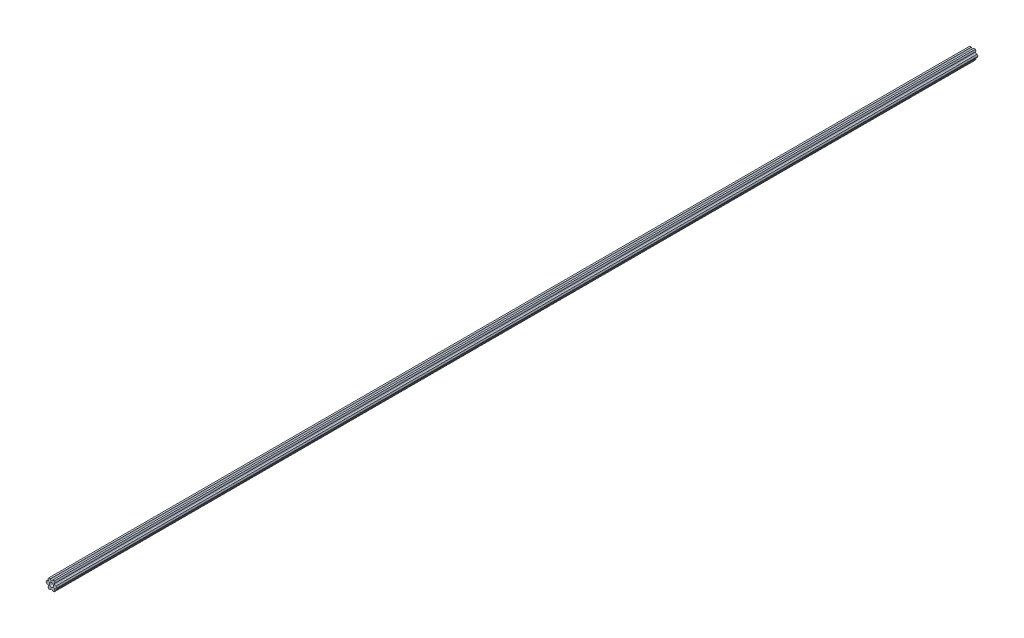
ISO-10303-21;
HEADER;
FILE_DESCRIPTION(('STEP AP214'),'2;1');
FILE_NAME('part.step','',(''),(''),'','','');
FILE_SCHEMA(('AUTOMOTIVE_DESIGN { 1 0 10303 214 1 1 1 1 }'));
ENDSEC;
DATA;
#1=APPLICATION_CONTEXT('core data for automotive mechanical design processes');
#2=APPLICATION_PROTOCOL_DEFINITION('international standard','automotive_design',2000,#1);
#3=PRODUCT_CONTEXT('',#1,'mechanical');
#4=PRODUCT('Part','Part','',(#3));
#5=PRODUCT_RELATED_PRODUCT_CATEGORY('part','',(#4));
#6=PRODUCT_DEFINITION_FORMATION('','',#4);
#7=PRODUCT_DEFINITION_CONTEXT('part definition',#1,'design');
#8=PRODUCT_DEFINITION('design','',#6,#7);
#9=PRODUCT_DEFINITION_SHAPE('','',#8);
#10=(LENGTH_UNIT() NAMED_UNIT(*) SI_UNIT(.MILLI.,.METRE.));
#11=(NAMED_UNIT(*) PLANE_ANGLE_UNIT() SI_UNIT($,.RADIAN.));
#12=(NAMED_UNIT(*) SI_UNIT($,.STERADIAN.) SOLID_ANGLE_UNIT());
#13=UNCERTAINTY_MEASURE_WITH_UNIT(LENGTH_MEASURE(1.E-05),#10,'distance_accuracy_value','');
#14=(GEOMETRIC_REPRESENTATION_CONTEXT(3) GLOBAL_UNCERTAINTY_ASSIGNED_CONTEXT((#13)) GLOBAL_UNIT_ASSIGNED_CONTEXT((#10,
#11,#12)) REPRESENTATION_CONTEXT('',''));
#15=CARTESIAN_POINT('',(0.,0.,0.));
#16=DIRECTION('',(0.,0.,1.));
#17=DIRECTION('',(1.,0.,0.));
#18=AXIS2_PLACEMENT_3D('',#15,#16,#17);
#19=CARTESIAN_POINT('',(4.06945337238307,2.3495,914.4));
#20=DIRECTION('',(0.,0.,-1.));
#21=DIRECTION('',(-1.,0.,0.));
#22=AXIS2_PLACEMENT_3D('',#19,#20,#21);
#23=PLANE('',#22);
#24=CARTESIAN_POINT('',(4.06945337238307,2.3495,914.4));
#25=DIRECTION('',(0.,0.,-1.));
#26=DIRECTION('',(-1.,0.,0.));
#27=AXIS2_PLACEMENT_3D('',#24,#25,#26);
#28=CIRCLE('',#27,1.0668);
#29=CARTESIAN_POINT('',(4.60285337238307,1.42562409924276,914.4));
#30=VERTEX_POINT('',#29);
#31=CARTESIAN_POINT('',(3.53605337238308,3.27337590075724,914.4));
#32=VERTEX_POINT('',#31);
#33=EDGE_CURVE('E235',#30,#32,#28,.T.);
#34=ORIENTED_EDGE('',*,*,#33,.T.);
#35=DIRECTION('',(-0.5,0.866025403784439,0.));
#36=VECTOR('',#35,1.);
#37=CARTESIAN_POINT('',(3.53605337238308,3.27337590075724,914.4));
#38=LINE('',#37,#36);
#39=CARTESIAN_POINT('',(2.71296891492205,4.699,914.4));
#40=VERTEX_POINT('',#39);
#41=EDGE_CURVE('E132',#32,#40,#38,.T.);
#42=ORIENTED_EDGE('',*,*,#41,.T.);
#43=DIRECTION('',(-1.,0.,0.));
#44=VECTOR('',#43,1.);
#45=CARTESIAN_POINT('',(2.71296891492205,4.699,914.4));
#46=LINE('',#45,#44);
#47=CARTESIAN_POINT('',(1.0668,4.699,914.4));
#48=VERTEX_POINT('',#47);
#49=EDGE_CURVE('E279',#40,#48,#46,.T.);
#50=ORIENTED_EDGE('',*,*,#49,.T.);
#51=CARTESIAN_POINT('',(0.,4.699,914.4));
#52=DIRECTION('',(0.,0.,-1.));
#53=DIRECTION('',(-1.,0.,0.));
#54=AXIS2_PLACEMENT_3D('',#51,#52,#53);
#55=CIRCLE('',#54,1.0668);
#56=CARTESIAN_POINT('',(-1.0668,4.699,914.4));
#57=VERTEX_POINT('',#56);
#58=EDGE_CURVE('E300',#48,#57,#55,.T.);
#59=ORIENTED_EDGE('',*,*,#58,.T.);
#60=DIRECTION('',(-1.,0.,0.));
#61=VECTOR('',#60,1.);
#62=CARTESIAN_POINT('',(-1.0668,4.699,914.4));
#63=LINE('',#62,#61);
#64=CARTESIAN_POINT('',(-2.71296891492205,4.699,914.4));
#65=VERTEX_POINT('',#64);
#66=EDGE_CURVE('E294',#57,#65,#63,.T.);
#67=ORIENTED_EDGE('',*,*,#66,.T.);
#68=DIRECTION('',(-0.5,-0.866025403784439,0.));
#69=VECTOR('',#68,1.);
#70=CARTESIAN_POINT('',(-2.71296891492205,4.699,914.4));
#71=LINE('',#70,#69);
#72=CARTESIAN_POINT('',(-3.53605337238308,3.27337590075724,914.4));
#73=VERTEX_POINT('',#72);
#74=EDGE_CURVE('E297',#65,#73,#71,.T.);
#75=ORIENTED_EDGE('',*,*,#74,.T.);
#76=CARTESIAN_POINT('',(-4.06945337238307,2.3495,914.4));
#77=DIRECTION('',(0.,0.,-1.));
#78=DIRECTION('',(-1.,0.,0.));
#79=AXIS2_PLACEMENT_3D('',#76,#77,#78);
#80=CIRCLE('',#79,1.0668);
#81=CARTESIAN_POINT('',(-4.60285337238308,1.42562409924276,914.4));
#82=VERTEX_POINT('',#81);
#83=EDGE_CURVE('E299',#73,#82,#80,.T.);
#84=ORIENTED_EDGE('',*,*,#83,.T.);
#85=DIRECTION('',(-0.499999999999998,-0.86602540378444,0.));
#86=VECTOR('',#85,1.);
#87=CARTESIAN_POINT('',(-4.60285337238308,1.42562409924276,914.4));
#88=LINE('',#87,#86);
#89=CARTESIAN_POINT('',(-5.4259378298441,0.,914.4));
#90=VERTEX_POINT('',#89);
#91=EDGE_CURVE('E303',#82,#90,#88,.T.);
#92=ORIENTED_EDGE('',*,*,#91,.T.);
#93=DIRECTION('',(0.499999999999997,-0.866025403784441,0.));
#94=VECTOR('',#93,1.);
#95=CARTESIAN_POINT('',(-5.4259378298441,0.,914.4));
#96=LINE('',#95,#94);
#97=CARTESIAN_POINT('',(-4.60285337238308,-1.42562409924276,914.4));
#98=VERTEX_POINT('',#97);
#99=EDGE_CURVE('E307',#90,#98,#96,.T.);
#100=ORIENTED_EDGE('',*,*,#99,.T.);
#101=CARTESIAN_POINT('',(-4.06945337238308,-2.3495,914.4));
#102=DIRECTION('',(0.,0.,-1.));
#103=DIRECTION('',(-1.,0.,0.));
#104=AXIS2_PLACEMENT_3D('',#101,#102,#103);
#105=CIRCLE('',#104,1.0668);
#106=CARTESIAN_POINT('',(-3.53605337238308,-3.27337590075724,914.4));
#107=VERTEX_POINT('',#106);
#108=EDGE_CURVE('E310',#98,#107,#105,.T.);
#109=ORIENTED_EDGE('',*,*,#108,.T.);
#110=DIRECTION('',(0.5,-0.866025403784439,0.));
#111=VECTOR('',#110,1.);
#112=CARTESIAN_POINT('',(-3.53605337238308,-3.27337590075724,914.4));
#113=LINE('',#112,#111);
#114=CARTESIAN_POINT('',(-2.71296891492206,-4.699,914.4));
#115=VERTEX_POINT('',#114);
#116=EDGE_CURVE('E313',#107,#115,#113,.T.);
#117=ORIENTED_EDGE('',*,*,#116,.T.);
#118=DIRECTION('',(1.,0.,0.));
#119=VECTOR('',#118,1.);
#120=CARTESIAN_POINT('',(-2.71296891492206,-4.699,914.4));
#121=LINE('',#120,#119);
#122=CARTESIAN_POINT('',(-1.0668,-4.699,914.4));
#123=VERTEX_POINT('',#122);
#124=EDGE_CURVE('E311',#115,#123,#121,.T.);
#125=ORIENTED_EDGE('',*,*,#124,.T.);
#126=CARTESIAN_POINT('',(0.,-4.699,914.4));
#127=DIRECTION('',(0.,0.,-1.));
#128=DIRECTION('',(-1.,0.,0.));
#129=AXIS2_PLACEMENT_3D('',#126,#127,#128);
#130=CIRCLE('',#129,1.0668);
#131=CARTESIAN_POINT('',(1.0668,-4.699,914.4));
#132=VERTEX_POINT('',#131);
#133=EDGE_CURVE('E312',#123,#132,#130,.T.);
#134=ORIENTED_EDGE('',*,*,#133,.T.);
#135=DIRECTION('',(1.,0.,0.));
#136=VECTOR('',#135,1.);
#137=CARTESIAN_POINT('',(1.0668,-4.699,914.4));
#138=LINE('',#137,#136);
#139=CARTESIAN_POINT('',(2.71296891492204,-4.699,914.4));
#140=VERTEX_POINT('',#139);
#141=EDGE_CURVE('E320',#132,#140,#138,.T.);
#142=ORIENTED_EDGE('',*,*,#141,.T.);
#143=DIRECTION('',(0.5,0.866025403784439,0.));
#144=VECTOR('',#143,1.);
#145=CARTESIAN_POINT('',(2.71296891492204,-4.699,914.4));
#146=LINE('',#145,#144);
#147=CARTESIAN_POINT('',(3.53605337238307,-3.27337590075724,914.4));
#148=VERTEX_POINT('',#147);
#149=EDGE_CURVE('E178',#140,#148,#146,.T.);
#150=ORIENTED_EDGE('',*,*,#149,.T.);
#151=CARTESIAN_POINT('',(4.06945337238307,-2.3495,914.4));
#152=DIRECTION('',(0.,0.,-1.));
#153=DIRECTION('',(-1.,0.,0.));
#154=AXIS2_PLACEMENT_3D('',#151,#152,#153);
#155=CIRCLE('',#154,1.0668);
#156=CARTESIAN_POINT('',(4.60285337238308,-1.42562409924276,914.4));
#157=VERTEX_POINT('',#156);
#158=EDGE_CURVE('E174',#148,#157,#155,.T.);
#159=ORIENTED_EDGE('',*,*,#158,.T.);
#160=DIRECTION('',(0.499999999999998,0.86602540378444,0.));
#161=VECTOR('',#160,1.);
#162=CARTESIAN_POINT('',(4.60285337238308,-1.42562409924276,914.4));
#163=LINE('',#162,#161);
#164=CARTESIAN_POINT('',(5.4259378298441,0.,914.4));
#165=VERTEX_POINT('',#164);
#166=EDGE_CURVE('E180',#157,#165,#163,.T.);
#167=ORIENTED_EDGE('',*,*,#166,.T.);
#168=DIRECTION('',(-0.500000000000001,0.866025403784438,0.));
#169=VECTOR('',#168,1.);
#170=CARTESIAN_POINT('',(5.4259378298441,0.,914.4));
#171=LINE('',#170,#169);
#172=EDGE_CURVE('E59',#165,#30,#171,.T.);
#173=ORIENTED_EDGE('',*,*,#172,.T.);
#174=EDGE_LOOP('',(#34,#42,#50,#59,#67,#75,#84,#92,#100,#109,#117,#125,#134,#142,#150,#159,#167,#173));
#175=FACE_BOUND('',#174,.T.);
#176=CARTESIAN_POINT('',(0.,0.,914.4));
#177=DIRECTION('',(0.,0.,1.));
#178=DIRECTION('',(-1.,0.,0.));
#179=AXIS2_PLACEMENT_3D('',#176,#177,#178);
#180=CIRCLE('',#179,2.159);
#181=CARTESIAN_POINT('',(-2.159,0.,914.4));
#182=VERTEX_POINT('',#181);
#183=EDGE_CURVE('E205',#182,#182,#180,.T.);
#184=ORIENTED_EDGE('',*,*,#183,.F.);
#185=EDGE_LOOP('',(#184));
#186=FACE_BOUND('',#185,.T.);
#187=ADVANCED_FACE('F41',(#175,#186),#23,.F.);
#188=CARTESIAN_POINT('',(4.06945337238307,2.3495,0.));
#189=DIRECTION('',(0.,0.,-1.));
#190=DIRECTION('',(-1.,0.,0.));
#191=AXIS2_PLACEMENT_3D('',#188,#189,#190);
#192=PLANE('',#191);
#193=CARTESIAN_POINT('',(4.06945337238307,2.3495,0.));
#194=DIRECTION('',(0.,0.,-1.));
#195=DIRECTION('',(-1.,0.,0.));
#196=AXIS2_PLACEMENT_3D('',#193,#194,#195);
#197=CIRCLE('',#196,1.0668);
#198=CARTESIAN_POINT('',(4.60285337238307,1.42562409924276,0.));
#199=VERTEX_POINT('',#198);
#200=CARTESIAN_POINT('',(3.53605337238308,3.27337590075724,0.));
#201=VERTEX_POINT('',#200);
#202=EDGE_CURVE('E196',#199,#201,#197,.T.);
#203=ORIENTED_EDGE('',*,*,#202,.F.);
#204=DIRECTION('',(-0.500000000000001,0.866025403784438,0.));
#205=VECTOR('',#204,1.);
#206=CARTESIAN_POINT('',(5.4259378298441,0.,0.));
#207=LINE('',#206,#205);
#208=CARTESIAN_POINT('',(5.4259378298441,0.,0.));
#209=VERTEX_POINT('',#208);
#210=EDGE_CURVE('E125',#209,#199,#207,.T.);
#211=ORIENTED_EDGE('',*,*,#210,.F.);
#212=DIRECTION('',(0.499999999999998,0.86602540378444,0.));
#213=VECTOR('',#212,1.);
#214=CARTESIAN_POINT('',(4.60285337238308,-1.42562409924276,0.));
#215=LINE('',#214,#213);
#216=CARTESIAN_POINT('',(4.60285337238308,-1.42562409924276,0.));
#217=VERTEX_POINT('',#216);
#218=EDGE_CURVE('E120',#217,#209,#215,.T.);
#219=ORIENTED_EDGE('',*,*,#218,.F.);
#220=CARTESIAN_POINT('',(4.06945337238307,-2.3495,0.));
#221=DIRECTION('',(0.,0.,-1.));
#222=DIRECTION('',(-1.,0.,0.));
#223=AXIS2_PLACEMENT_3D('',#220,#221,#222);
#224=CIRCLE('',#223,1.0668);
#225=CARTESIAN_POINT('',(3.53605337238307,-3.27337590075724,0.));
#226=VERTEX_POINT('',#225);
#227=EDGE_CURVE('E188',#226,#217,#224,.T.);
#228=ORIENTED_EDGE('',*,*,#227,.F.);
#229=DIRECTION('',(0.5,0.866025403784439,0.));
#230=VECTOR('',#229,1.);
#231=CARTESIAN_POINT('',(2.71296891492204,-4.699,0.));
#232=LINE('',#231,#230);
#233=CARTESIAN_POINT('',(2.71296891492204,-4.699,0.));
#234=VERTEX_POINT('',#233);
#235=EDGE_CURVE('E228',#234,#226,#232,.T.);
#236=ORIENTED_EDGE('',*,*,#235,.F.);
#237=DIRECTION('',(1.,0.,0.));
#238=VECTOR('',#237,1.);
#239=CARTESIAN_POINT('',(1.0668,-4.699,0.));
#240=LINE('',#239,#238);
#241=CARTESIAN_POINT('',(1.0668,-4.699,0.));
#242=VERTEX_POINT('',#241);
#243=EDGE_CURVE('E227',#242,#234,#240,.T.);
#244=ORIENTED_EDGE('',*,*,#243,.F.);
#245=CARTESIAN_POINT('',(0.,-4.699,0.));
#246=DIRECTION('',(0.,0.,-1.));
#247=DIRECTION('',(-1.,0.,0.));
#248=AXIS2_PLACEMENT_3D('',#245,#246,#247);
#249=CIRCLE('',#248,1.0668);
#250=CARTESIAN_POINT('',(-1.0668,-4.699,0.));
#251=VERTEX_POINT('',#250);
#252=EDGE_CURVE('E221',#251,#242,#249,.T.);
#253=ORIENTED_EDGE('',*,*,#252,.F.);
#254=DIRECTION('',(1.,0.,0.));
#255=VECTOR('',#254,1.);
#256=CARTESIAN_POINT('',(-2.71296891492206,-4.699,0.));
#257=LINE('',#256,#255);
#258=CARTESIAN_POINT('',(-2.71296891492206,-4.699,0.));
#259=VERTEX_POINT('',#258);
#260=EDGE_CURVE('E225',#259,#251,#257,.T.);
#261=ORIENTED_EDGE('',*,*,#260,.F.);
#262=DIRECTION('',(0.5,-0.866025403784439,0.));
#263=VECTOR('',#262,1.);
#264=CARTESIAN_POINT('',(-3.53605337238308,-3.27337590075724,0.));
#265=LINE('',#264,#263);
#266=CARTESIAN_POINT('',(-3.53605337238308,-3.27337590075724,0.));
#267=VERTEX_POINT('',#266);
#268=EDGE_CURVE('E219',#267,#259,#265,.T.);
#269=ORIENTED_EDGE('',*,*,#268,.F.);
#270=CARTESIAN_POINT('',(-4.06945337238308,-2.3495,0.));
#271=DIRECTION('',(0.,0.,-1.));
#272=DIRECTION('',(-1.,0.,0.));
#273=AXIS2_PLACEMENT_3D('',#270,#271,#272);
#274=CIRCLE('',#273,1.0668);
#275=CARTESIAN_POINT('',(-4.60285337238308,-1.42562409924276,0.));
#276=VERTEX_POINT('',#275);
#277=EDGE_CURVE('E217',#276,#267,#274,.T.);
#278=ORIENTED_EDGE('',*,*,#277,.F.);
#279=DIRECTION('',(0.499999999999997,-0.866025403784441,0.));
#280=VECTOR('',#279,1.);
#281=CARTESIAN_POINT('',(-5.4259378298441,0.,0.));
#282=LINE('',#281,#280);
#283=CARTESIAN_POINT('',(-5.4259378298441,0.,0.));
#284=VERTEX_POINT('',#283);
#285=EDGE_CURVE('E216',#284,#276,#282,.T.);
#286=ORIENTED_EDGE('',*,*,#285,.F.);
#287=DIRECTION('',(-0.499999999999998,-0.86602540378444,0.));
#288=VECTOR('',#287,1.);
#289=CARTESIAN_POINT('',(-4.60285337238308,1.42562409924276,0.));
#290=LINE('',#289,#288);
#291=CARTESIAN_POINT('',(-4.60285337238308,1.42562409924276,0.));
#292=VERTEX_POINT('',#291);
#293=EDGE_CURVE('E212',#292,#284,#290,.T.);
#294=ORIENTED_EDGE('',*,*,#293,.F.);
#295=CARTESIAN_POINT('',(-4.06945337238307,2.3495,0.));
#296=DIRECTION('',(0.,0.,-1.));
#297=DIRECTION('',(-1.,0.,0.));
#298=AXIS2_PLACEMENT_3D('',#295,#296,#297);
#299=CIRCLE('',#298,1.0668);
#300=CARTESIAN_POINT('',(-3.53605337238308,3.27337590075724,0.));
#301=VERTEX_POINT('',#300);
#302=EDGE_CURVE('E215',#301,#292,#299,.T.);
#303=ORIENTED_EDGE('',*,*,#302,.F.);
#304=DIRECTION('',(-0.5,-0.866025403784439,0.));
#305=VECTOR('',#304,1.);
#306=CARTESIAN_POINT('',(-2.71296891492205,4.699,0.));
#307=LINE('',#306,#305);
#308=CARTESIAN_POINT('',(-2.71296891492205,4.699,0.));
#309=VERTEX_POINT('',#308);
#310=EDGE_CURVE('E209',#309,#301,#307,.T.);
#311=ORIENTED_EDGE('',*,*,#310,.F.);
#312=DIRECTION('',(-1.,0.,0.));
#313=VECTOR('',#312,1.);
#314=CARTESIAN_POINT('',(-1.0668,4.699,0.));
#315=LINE('',#314,#313);
#316=CARTESIAN_POINT('',(-1.0668,4.699,0.));
#317=VERTEX_POINT('',#316);
#318=EDGE_CURVE('E208',#317,#309,#315,.T.);
#319=ORIENTED_EDGE('',*,*,#318,.F.);
#320=CARTESIAN_POINT('',(0.,4.699,0.));
#321=DIRECTION('',(0.,0.,-1.));
#322=DIRECTION('',(-1.,0.,0.));
#323=AXIS2_PLACEMENT_3D('',#320,#321,#322);
#324=CIRCLE('',#323,1.0668);
#325=CARTESIAN_POINT('',(1.0668,4.699,0.));
#326=VERTEX_POINT('',#325);
#327=EDGE_CURVE('E206',#326,#317,#324,.T.);
#328=ORIENTED_EDGE('',*,*,#327,.F.);
#329=DIRECTION('',(-1.,0.,0.));
#330=VECTOR('',#329,1.);
#331=CARTESIAN_POINT('',(2.71296891492205,4.699,0.));
#332=LINE('',#331,#330);
#333=CARTESIAN_POINT('',(2.71296891492205,4.699,0.));
#334=VERTEX_POINT('',#333);
#335=EDGE_CURVE('E204',#334,#326,#332,.T.);
#336=ORIENTED_EDGE('',*,*,#335,.F.);
#337=DIRECTION('',(-0.5,0.866025403784439,0.));
#338=VECTOR('',#337,1.);
#339=CARTESIAN_POINT('',(3.53605337238308,3.27337590075724,0.));
#340=LINE('',#339,#338);
#341=EDGE_CURVE('E203',#201,#334,#340,.T.);
#342=ORIENTED_EDGE('',*,*,#341,.F.);
#343=EDGE_LOOP('',(#203,#211,#219,#228,#236,#244,#253,#261,#269,#278,#286,#294,#303,#311,#319,
#328,#336,#342));
#344=FACE_BOUND('',#343,.T.);
#345=CARTESIAN_POINT('',(0.,0.,0.));
#346=DIRECTION('',(0.,0.,1.));
#347=DIRECTION('',(-1.,0.,0.));
#348=AXIS2_PLACEMENT_3D('',#345,#346,#347);
#349=CIRCLE('',#348,2.159);
#350=CARTESIAN_POINT('',(-2.159,0.,0.));
#351=VERTEX_POINT('',#350);
#352=EDGE_CURVE('E545',#351,#351,#349,.T.);
#353=ORIENTED_EDGE('',*,*,#352,.T.);
#354=EDGE_LOOP('',(#353));
#355=FACE_BOUND('',#354,.T.);
#356=ADVANCED_FACE('F285',(#344,#355),#192,.T.);
#357=CARTESIAN_POINT('',(4.06945337238307,2.3495,914.4));
#358=DIRECTION('',(0.,0.,-1.));
#359=DIRECTION('',(-1.,0.,0.));
#360=AXIS2_PLACEMENT_3D('',#357,#358,#359);
#361=CYLINDRICAL_SURFACE('',#360,1.0668);
#362=ORIENTED_EDGE('',*,*,#202,.T.);
#363=DIRECTION('',(0.,0.,-1.));
#364=VECTOR('',#363,1.);
#365=CARTESIAN_POINT('',(3.53605337238308,3.27337590075724,914.4));
#366=LINE('',#365,#364);
#367=EDGE_CURVE('E11',#32,#201,#366,.T.);
#368=ORIENTED_EDGE('',*,*,#367,.F.);
#369=ORIENTED_EDGE('',*,*,#33,.F.);
#370=DIRECTION('',(0.,0.,-1.));
#371=VECTOR('',#370,1.);
#372=CARTESIAN_POINT('',(4.60285337238307,1.42562409924276,914.4));
#373=LINE('',#372,#371);
#374=EDGE_CURVE('E191',#30,#199,#373,.T.);
#375=ORIENTED_EDGE('',*,*,#374,.T.);
#376=EDGE_LOOP('',(#362,#368,#369,#375));
#377=FACE_BOUND('',#376,.T.);
#378=ADVANCED_FACE('F43',(#377),#361,.F.);
#379=CARTESIAN_POINT('',(3.53605337238308,3.27337590075724,914.4));
#380=DIRECTION('',(-0.866025403784439,-0.5,0.));
#381=DIRECTION('',(0.5,-0.866025403784439,0.));
#382=AXIS2_PLACEMENT_3D('',#379,#380,#381);
#383=PLANE('',#382);
#384=ORIENTED_EDGE('',*,*,#341,.T.);
#385=DIRECTION('',(0.,0.,-1.));
#386=VECTOR('',#385,1.);
#387=CARTESIAN_POINT('',(2.71296891492205,4.699,914.4));
#388=LINE('',#387,#386);
#389=EDGE_CURVE('E49',#40,#334,#388,.T.);
#390=ORIENTED_EDGE('',*,*,#389,.F.);
#391=ORIENTED_EDGE('',*,*,#41,.F.);
#392=ORIENTED_EDGE('',*,*,#367,.T.);
#393=EDGE_LOOP('',(#384,#390,#391,#392));
#394=FACE_BOUND('',#393,.T.);
#395=ADVANCED_FACE('F352',(#394),#383,.F.);
#396=CARTESIAN_POINT('',(2.71296891492205,4.699,914.4));
#397=DIRECTION('',(0.,-1.,0.));
#398=DIRECTION('',(0.,0.,-1.));
#399=AXIS2_PLACEMENT_3D('',#396,#397,#398);
#400=PLANE('',#399);
#401=ORIENTED_EDGE('',*,*,#335,.T.);
#402=DIRECTION('',(0.,0.,-1.));
#403=VECTOR('',#402,1.);
#404=CARTESIAN_POINT('',(1.0668,4.699,914.4));
#405=LINE('',#404,#403);
#406=EDGE_CURVE('E269',#48,#326,#405,.T.);
#407=ORIENTED_EDGE('',*,*,#406,.F.);
#408=ORIENTED_EDGE('',*,*,#49,.F.);
#409=ORIENTED_EDGE('',*,*,#389,.T.);
#410=EDGE_LOOP('',(#401,#407,#408,#409));
#411=FACE_BOUND('',#410,.T.);
#412=ADVANCED_FACE('F277',(#411),#400,.F.);
#413=CARTESIAN_POINT('',(0.,4.699,914.4));
#414=DIRECTION('',(0.,0.,-1.));
#415=DIRECTION('',(-1.,0.,0.));
#416=AXIS2_PLACEMENT_3D('',#413,#414,#415);
#417=CYLINDRICAL_SURFACE('',#416,1.0668);
#418=ORIENTED_EDGE('',*,*,#327,.T.);
#419=DIRECTION('',(0.,0.,-1.));
#420=VECTOR('',#419,1.);
#421=CARTESIAN_POINT('',(-1.0668,4.699,914.4));
#422=LINE('',#421,#420);
#423=EDGE_CURVE('E270',#57,#317,#422,.T.);
#424=ORIENTED_EDGE('',*,*,#423,.F.);
#425=ORIENTED_EDGE('',*,*,#58,.F.);
#426=ORIENTED_EDGE('',*,*,#406,.T.);
#427=EDGE_LOOP('',(#418,#424,#425,#426));
#428=FACE_BOUND('',#427,.T.);
#429=ADVANCED_FACE('F290',(#428),#417,.F.);
#430=CARTESIAN_POINT('',(-1.0668,4.699,914.4));
#431=DIRECTION('',(0.,-1.,0.));
#432=DIRECTION('',(0.,0.,-1.));
#433=AXIS2_PLACEMENT_3D('',#430,#431,#432);
#434=PLANE('',#433);
#435=ORIENTED_EDGE('',*,*,#318,.T.);
#436=DIRECTION('',(0.,0.,-1.));
#437=VECTOR('',#436,1.);
#438=CARTESIAN_POINT('',(-2.71296891492205,4.699,914.4));
#439=LINE('',#438,#437);
#440=EDGE_CURVE('E262',#65,#309,#439,.T.);
#441=ORIENTED_EDGE('',*,*,#440,.F.);
#442=ORIENTED_EDGE('',*,*,#66,.F.);
#443=ORIENTED_EDGE('',*,*,#423,.T.);
#444=EDGE_LOOP('',(#435,#441,#442,#443));
#445=FACE_BOUND('',#444,.T.);
#446=ADVANCED_FACE('F295',(#445),#434,.F.);
#447=CARTESIAN_POINT('',(-2.71296891492205,4.699,914.4));
#448=DIRECTION('',(0.866025403784439,-0.5,0.));
#449=DIRECTION('',(0.5,0.866025403784439,0.));
#450=AXIS2_PLACEMENT_3D('',#447,#448,#449);
#451=PLANE('',#450);
#452=ORIENTED_EDGE('',*,*,#310,.T.);
#453=DIRECTION('',(0.,0.,-1.));
#454=VECTOR('',#453,1.);
#455=CARTESIAN_POINT('',(-3.53605337238308,3.27337590075724,914.4));
#456=LINE('',#455,#454);
#457=EDGE_CURVE('E261',#73,#301,#456,.T.);
#458=ORIENTED_EDGE('',*,*,#457,.F.);
#459=ORIENTED_EDGE('',*,*,#74,.F.);
#460=ORIENTED_EDGE('',*,*,#440,.T.);
#461=EDGE_LOOP('',(#452,#458,#459,#460));
#462=FACE_BOUND('',#461,.T.);
#463=ADVANCED_FACE('F365',(#462),#451,.F.);
#464=CARTESIAN_POINT('',(-4.06945337238307,2.3495,914.4));
#465=DIRECTION('',(0.,0.,-1.));
#466=DIRECTION('',(-1.,0.,0.));
#467=AXIS2_PLACEMENT_3D('',#464,#465,#466);
#468=CYLINDRICAL_SURFACE('',#467,1.0668);
#469=ORIENTED_EDGE('',*,*,#302,.T.);
#470=DIRECTION('',(0.,0.,-1.));
#471=VECTOR('',#470,1.);
#472=CARTESIAN_POINT('',(-4.60285337238308,1.42562409924276,914.4));
#473=LINE('',#472,#471);
#474=EDGE_CURVE('E256',#82,#292,#473,.T.);
#475=ORIENTED_EDGE('',*,*,#474,.F.);
#476=ORIENTED_EDGE('',*,*,#83,.F.);
#477=ORIENTED_EDGE('',*,*,#457,.T.);
#478=EDGE_LOOP('',(#469,#475,#476,#477));
#479=FACE_BOUND('',#478,.T.);
#480=ADVANCED_FACE('F370',(#479),#468,.F.);
#481=CARTESIAN_POINT('',(-4.60285337238308,1.42562409924276,914.4));
#482=DIRECTION('',(0.86602540378444,-0.499999999999998,0.));
#483=DIRECTION('',(0.499999999999998,0.86602540378444,0.));
#484=AXIS2_PLACEMENT_3D('',#481,#482,#483);
#485=PLANE('',#484);
#486=ORIENTED_EDGE('',*,*,#293,.T.);
#487=DIRECTION('',(0.,0.,-1.));
#488=VECTOR('',#487,1.);
#489=CARTESIAN_POINT('',(-5.4259378298441,0.,914.4));
#490=LINE('',#489,#488);
#491=EDGE_CURVE('E254',#90,#284,#490,.T.);
#492=ORIENTED_EDGE('',*,*,#491,.F.);
#493=ORIENTED_EDGE('',*,*,#91,.F.);
#494=ORIENTED_EDGE('',*,*,#474,.T.);
#495=EDGE_LOOP('',(#486,#492,#493,#494));
#496=FACE_BOUND('',#495,.T.);
#497=ADVANCED_FACE('F371',(#496),#485,.F.);
#498=CARTESIAN_POINT('',(-5.4259378298441,0.,914.4));
#499=DIRECTION('',(0.866025403784441,0.499999999999997,0.));
#500=DIRECTION('',(-0.499999999999997,0.866025403784441,0.));
#501=AXIS2_PLACEMENT_3D('',#498,#499,#500);
#502=PLANE('',#501);
#503=ORIENTED_EDGE('',*,*,#285,.T.);
#504=DIRECTION('',(0.,0.,-1.));
#505=VECTOR('',#504,1.);
#506=CARTESIAN_POINT('',(-4.60285337238308,-1.42562409924276,914.4));
#507=LINE('',#506,#505);
#508=EDGE_CURVE('E252',#98,#276,#507,.T.);
#509=ORIENTED_EDGE('',*,*,#508,.F.);
#510=ORIENTED_EDGE('',*,*,#99,.F.);
#511=ORIENTED_EDGE('',*,*,#491,.T.);
#512=EDGE_LOOP('',(#503,#509,#510,#511));
#513=FACE_BOUND('',#512,.T.);
#514=ADVANCED_FACE('F374',(#513),#502,.F.);
#515=CARTESIAN_POINT('',(-4.06945337238308,-2.3495,914.4));
#516=DIRECTION('',(0.,0.,-1.));
#517=DIRECTION('',(-1.,0.,0.));
#518=AXIS2_PLACEMENT_3D('',#515,#516,#517);
#519=CYLINDRICAL_SURFACE('',#518,1.0668);
#520=ORIENTED_EDGE('',*,*,#277,.T.);
#521=DIRECTION('',(0.,0.,-1.));
#522=VECTOR('',#521,1.);
#523=CARTESIAN_POINT('',(-3.53605337238308,-3.27337590075724,914.4));
#524=LINE('',#523,#522);
#525=EDGE_CURVE('E246',#107,#267,#524,.T.);
#526=ORIENTED_EDGE('',*,*,#525,.F.);
#527=ORIENTED_EDGE('',*,*,#108,.F.);
#528=ORIENTED_EDGE('',*,*,#508,.T.);
#529=EDGE_LOOP('',(#520,#526,#527,#528));
#530=FACE_BOUND('',#529,.T.);
#531=ADVANCED_FACE('F377',(#530),#519,.F.);
#532=CARTESIAN_POINT('',(-3.53605337238308,-3.27337590075724,914.4));
#533=DIRECTION('',(0.866025403784439,0.5,0.));
#534=DIRECTION('',(-0.5,0.866025403784439,0.));
#535=AXIS2_PLACEMENT_3D('',#532,#533,#534);
#536=PLANE('',#535);
#537=ORIENTED_EDGE('',*,*,#268,.T.);
#538=DIRECTION('',(0.,0.,-1.));
#539=VECTOR('',#538,1.);
#540=CARTESIAN_POINT('',(-2.71296891492206,-4.699,914.4));
#541=LINE('',#540,#539);
#542=EDGE_CURVE('E247',#115,#259,#541,.T.);
#543=ORIENTED_EDGE('',*,*,#542,.F.);
#544=ORIENTED_EDGE('',*,*,#116,.F.);
#545=ORIENTED_EDGE('',*,*,#525,.T.);
#546=EDGE_LOOP('',(#537,#543,#544,#545));
#547=FACE_BOUND('',#546,.T.);
#548=ADVANCED_FACE('F382',(#547),#536,.F.);
#549=CARTESIAN_POINT('',(-2.71296891492206,-4.699,914.4));
#550=DIRECTION('',(0.,1.,0.));
#551=DIRECTION('',(0.,0.,1.));
#552=AXIS2_PLACEMENT_3D('',#549,#550,#551);
#553=PLANE('',#552);
#554=ORIENTED_EDGE('',*,*,#260,.T.);
#555=DIRECTION('',(0.,0.,-1.));
#556=VECTOR('',#555,1.);
#557=CARTESIAN_POINT('',(-1.0668,-4.699,914.4));
#558=LINE('',#557,#556);
#559=EDGE_CURVE('E243',#123,#251,#558,.T.);
#560=ORIENTED_EDGE('',*,*,#559,.F.);
#561=ORIENTED_EDGE('',*,*,#124,.F.);
#562=ORIENTED_EDGE('',*,*,#542,.T.);
#563=EDGE_LOOP('',(#554,#560,#561,#562));
#564=FACE_BOUND('',#563,.T.);
#565=ADVANCED_FACE('F390',(#564),#553,.F.);
#566=CARTESIAN_POINT('',(0.,-4.699,914.4));
#567=DIRECTION('',(0.,0.,-1.));
#568=DIRECTION('',(-1.,0.,0.));
#569=AXIS2_PLACEMENT_3D('',#566,#567,#568);
#570=CYLINDRICAL_SURFACE('',#569,1.0668);
#571=ORIENTED_EDGE('',*,*,#252,.T.);
#572=DIRECTION('',(0.,0.,-1.));
#573=VECTOR('',#572,1.);
#574=CARTESIAN_POINT('',(1.0668,-4.699,914.4));
#575=LINE('',#574,#573);
#576=EDGE_CURVE('E238',#132,#242,#575,.T.);
#577=ORIENTED_EDGE('',*,*,#576,.F.);
#578=ORIENTED_EDGE('',*,*,#133,.F.);
#579=ORIENTED_EDGE('',*,*,#559,.T.);
#580=EDGE_LOOP('',(#571,#577,#578,#579));
#581=FACE_BOUND('',#580,.T.);
#582=ADVANCED_FACE('F392',(#581),#570,.F.);
#583=CARTESIAN_POINT('',(1.0668,-4.699,914.4));
#584=DIRECTION('',(0.,1.,0.));
#585=DIRECTION('',(0.,0.,1.));
#586=AXIS2_PLACEMENT_3D('',#583,#584,#585);
#587=PLANE('',#586);
#588=ORIENTED_EDGE('',*,*,#243,.T.);
#589=DIRECTION('',(0.,0.,-1.));
#590=VECTOR('',#589,1.);
#591=CARTESIAN_POINT('',(2.71296891492204,-4.699,914.4));
#592=LINE('',#591,#590);
#593=EDGE_CURVE('E240',#140,#234,#592,.T.);
#594=ORIENTED_EDGE('',*,*,#593,.F.);
#595=ORIENTED_EDGE('',*,*,#141,.F.);
#596=ORIENTED_EDGE('',*,*,#576,.T.);
#597=EDGE_LOOP('',(#588,#594,#595,#596));
#598=FACE_BOUND('',#597,.T.);
#599=ADVANCED_FACE('F323',(#598),#587,.F.);
#600=CARTESIAN_POINT('',(2.71296891492204,-4.699,914.4));
#601=DIRECTION('',(-0.866025403784439,0.5,0.));
#602=DIRECTION('',(-0.5,-0.866025403784439,0.));
#603=AXIS2_PLACEMENT_3D('',#600,#601,#602);
#604=PLANE('',#603);
#605=ORIENTED_EDGE('',*,*,#235,.T.);
#606=DIRECTION('',(0.,0.,-1.));
#607=VECTOR('',#606,1.);
#608=CARTESIAN_POINT('',(3.53605337238307,-3.27337590075724,914.4));
#609=LINE('',#608,#607);
#610=EDGE_CURVE('E189',#148,#226,#609,.T.);
#611=ORIENTED_EDGE('',*,*,#610,.F.);
#612=ORIENTED_EDGE('',*,*,#149,.F.);
#613=ORIENTED_EDGE('',*,*,#593,.T.);
#614=EDGE_LOOP('',(#605,#611,#612,#613));
#615=FACE_BOUND('',#614,.T.);
#616=ADVANCED_FACE('F330',(#615),#604,.F.);
#617=CARTESIAN_POINT('',(4.06945337238307,-2.3495,914.4));
#618=DIRECTION('',(0.,0.,-1.));
#619=DIRECTION('',(-1.,0.,0.));
#620=AXIS2_PLACEMENT_3D('',#617,#618,#619);
#621=CYLINDRICAL_SURFACE('',#620,1.0668);
#622=ORIENTED_EDGE('',*,*,#227,.T.);
#623=DIRECTION('',(0.,0.,-1.));
#624=VECTOR('',#623,1.);
#625=CARTESIAN_POINT('',(4.60285337238308,-1.42562409924276,914.4));
#626=LINE('',#625,#624);
#627=EDGE_CURVE('E183',#157,#217,#626,.T.);
#628=ORIENTED_EDGE('',*,*,#627,.F.);
#629=ORIENTED_EDGE('',*,*,#158,.F.);
#630=ORIENTED_EDGE('',*,*,#610,.T.);
#631=EDGE_LOOP('',(#622,#628,#629,#630));
#632=FACE_BOUND('',#631,.T.);
#633=ADVANCED_FACE('F187',(#632),#621,.F.);
#634=CARTESIAN_POINT('',(4.60285337238308,-1.42562409924276,914.4));
#635=DIRECTION('',(-0.86602540378444,0.499999999999998,0.));
#636=DIRECTION('',(-0.499999999999998,-0.86602540378444,0.));
#637=AXIS2_PLACEMENT_3D('',#634,#635,#636);
#638=PLANE('',#637);
#639=ORIENTED_EDGE('',*,*,#218,.T.);
#640=DIRECTION('',(0.,0.,-1.));
#641=VECTOR('',#640,1.);
#642=CARTESIAN_POINT('',(5.4259378298441,0.,914.4));
#643=LINE('',#642,#641);
#644=EDGE_CURVE('E186',#165,#209,#643,.T.);
#645=ORIENTED_EDGE('',*,*,#644,.F.);
#646=ORIENTED_EDGE('',*,*,#166,.F.);
#647=ORIENTED_EDGE('',*,*,#627,.T.);
#648=EDGE_LOOP('',(#639,#645,#646,#647));
#649=FACE_BOUND('',#648,.T.);
#650=ADVANCED_FACE('F194',(#649),#638,.F.);
#651=CARTESIAN_POINT('',(5.4259378298441,0.,914.4));
#652=DIRECTION('',(-0.866025403784438,-0.500000000000002,0.));
#653=DIRECTION('',(0.500000000000001,-0.866025403784438,0.));
#654=AXIS2_PLACEMENT_3D('',#651,#652,#653);
#655=PLANE('',#654);
#656=ORIENTED_EDGE('',*,*,#210,.T.);
#657=ORIENTED_EDGE('',*,*,#374,.F.);
#658=ORIENTED_EDGE('',*,*,#172,.F.);
#659=ORIENTED_EDGE('',*,*,#644,.T.);
#660=EDGE_LOOP('',(#656,#657,#658,#659));
#661=FACE_BOUND('',#660,.T.);
#662=ADVANCED_FACE('F332',(#661),#655,.F.);
#663=CARTESIAN_POINT('',(0.,0.,914.4));
#664=DIRECTION('',(0.,0.,-1.));
#665=DIRECTION('',(-1.,0.,0.));
#666=AXIS2_PLACEMENT_3D('',#663,#664,#665);
#667=CYLINDRICAL_SURFACE('',#666,2.159);
#668=ORIENTED_EDGE('',*,*,#183,.T.);
#669=EDGE_LOOP('',(#668));
#670=FACE_BOUND('',#669,.T.);
#671=ORIENTED_EDGE('',*,*,#352,.F.);
#672=EDGE_LOOP('',(#671));
#673=FACE_BOUND('',#672,.T.);
#674=ADVANCED_FACE('F334',(#670,#673),#667,.F.);
#675=CLOSED_SHELL('',(#187,#356,#378,#395,#412,#429,#446,#463,#480,#497,#514,#531,#548,#565,
#582,#599,#616,#633,#650,#662,#674));
#676=MANIFOLD_SOLID_BREP('B2',#675);
#677=ADVANCED_BREP_SHAPE_REPRESENTATION('',(#18,#676),#14);
#678=SHAPE_DEFINITION_REPRESENTATION(#9,#677);
ENDSEC;
END-ISO-10303-21;
